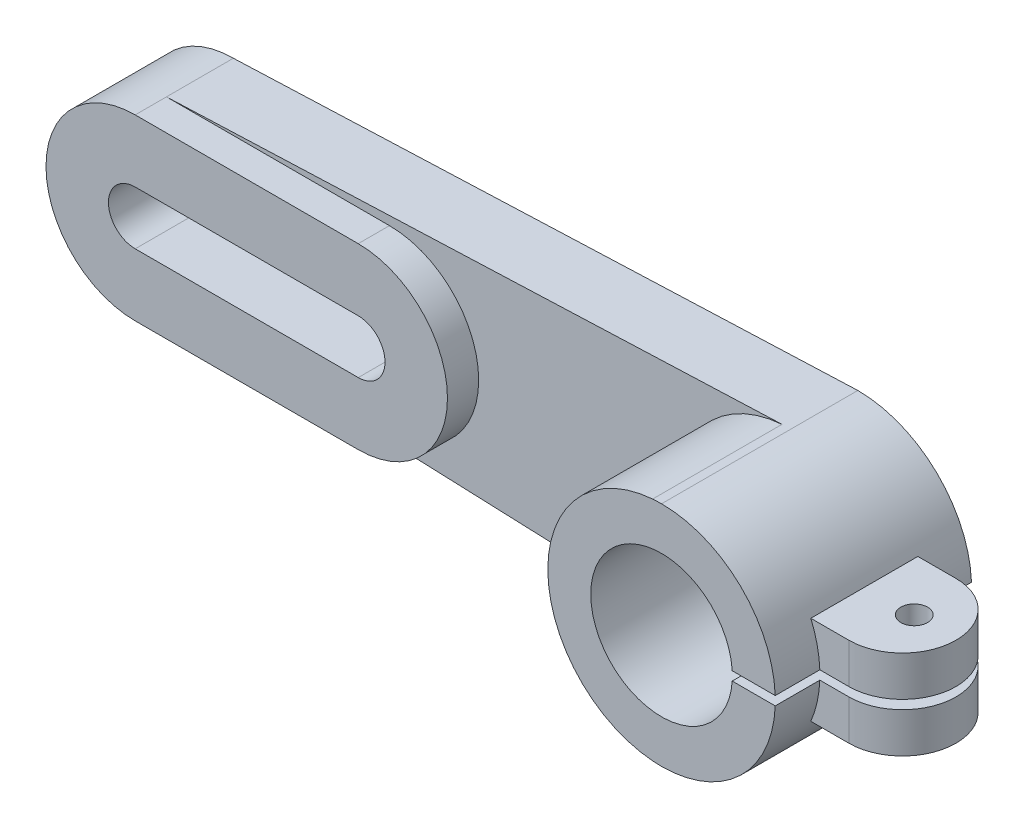
ISO-10303-21;
HEADER;
FILE_DESCRIPTION(('STEP AP214'),'2;1');
FILE_NAME('part.step','',(''),(''),'','','');
FILE_SCHEMA(('AUTOMOTIVE_DESIGN { 1 0 10303 214 1 1 1 1 }'));
ENDSEC;
DATA;
#1=APPLICATION_CONTEXT('core data for automotive mechanical design processes');
#2=APPLICATION_PROTOCOL_DEFINITION('international standard','automotive_design',2000,#1);
#3=PRODUCT_CONTEXT('',#1,'mechanical');
#4=PRODUCT('Part','Part','',(#3));
#5=PRODUCT_RELATED_PRODUCT_CATEGORY('part','',(#4));
#6=PRODUCT_DEFINITION_FORMATION('','',#4);
#7=PRODUCT_DEFINITION_CONTEXT('part definition',#1,'design');
#8=PRODUCT_DEFINITION('design','',#6,#7);
#9=PRODUCT_DEFINITION_SHAPE('','',#8);
#10=(LENGTH_UNIT() NAMED_UNIT(*) SI_UNIT(.MILLI.,.METRE.));
#11=(NAMED_UNIT(*) PLANE_ANGLE_UNIT() SI_UNIT($,.RADIAN.));
#12=(NAMED_UNIT(*) SI_UNIT($,.STERADIAN.) SOLID_ANGLE_UNIT());
#13=UNCERTAINTY_MEASURE_WITH_UNIT(LENGTH_MEASURE(1.E-05),#10,'distance_accuracy_value','');
#14=(GEOMETRIC_REPRESENTATION_CONTEXT(3) GLOBAL_UNCERTAINTY_ASSIGNED_CONTEXT((#13)) GLOBAL_UNIT_ASSIGNED_CONTEXT((#10,
#11,#12)) REPRESENTATION_CONTEXT('',''));
#15=CARTESIAN_POINT('',(0.,0.,0.));
#16=DIRECTION('',(0.,0.,1.));
#17=DIRECTION('',(1.,0.,0.));
#18=AXIS2_PLACEMENT_3D('',#15,#16,#17);
#19=CARTESIAN_POINT('',(32.,-10.,22.));
#20=DIRECTION('',(0.,-1.,0.));
#21=DIRECTION('',(0.,0.,-1.));
#22=AXIS2_PLACEMENT_3D('',#19,#20,#21);
#23=CYLINDRICAL_SURFACE('',#22,12.);
#24=DIRECTION('',(0.,-1.,0.));
#25=VECTOR('',#24,1.);
#26=CARTESIAN_POINT('',(32.,0.,34.));
#27=LINE('',#26,#25);
#28=CARTESIAN_POINT('',(32.,-10.,34.));
#29=VERTEX_POINT('',#28);
#30=CARTESIAN_POINT('',(32.,-1.,34.));
#31=VERTEX_POINT('',#30);
#32=EDGE_CURVE('E465',#29,#31,#27,.F.);
#33=ORIENTED_EDGE('',*,*,#32,.F.);
#34=CARTESIAN_POINT('',(32.,-10.,22.));
#35=DIRECTION('',(0.,-1.,0.));
#36=DIRECTION('',(1.,0.,0.));
#37=AXIS2_PLACEMENT_3D('',#34,#35,#36);
#38=CIRCLE('',#37,12.);
#39=CARTESIAN_POINT('',(32.,-10.,10.));
#40=VERTEX_POINT('',#39);
#41=EDGE_CURVE('E57',#40,#29,#38,.T.);
#42=ORIENTED_EDGE('',*,*,#41,.F.);
#43=DIRECTION('',(0.,1.,0.));
#44=VECTOR('',#43,1.);
#45=CARTESIAN_POINT('',(32.,-10.,10.));
#46=LINE('',#45,#44);
#47=CARTESIAN_POINT('',(32.,-1.,10.));
#48=VERTEX_POINT('',#47);
#49=EDGE_CURVE('E468',#48,#40,#46,.F.);
#50=ORIENTED_EDGE('',*,*,#49,.F.);
#51=CARTESIAN_POINT('',(32.,-1.,22.));
#52=DIRECTION('',(0.,1.,0.));
#53=DIRECTION('',(-1.,0.,0.));
#54=AXIS2_PLACEMENT_3D('',#51,#52,#53);
#55=CIRCLE('',#54,12.);
#56=EDGE_CURVE('E11',#31,#48,#55,.T.);
#57=ORIENTED_EDGE('',*,*,#56,.F.);
#58=EDGE_LOOP('',(#33,#42,#50,#57));
#59=FACE_BOUND('',#58,.T.);
#60=ADVANCED_FACE('F47',(#59),#23,.T.);
#61=CARTESIAN_POINT('',(32.,1.,22.));
#62=DIRECTION('',(0.,1.,0.));
#63=DIRECTION('',(0.,0.,1.));
#64=AXIS2_PLACEMENT_3D('',#61,#62,#63);
#65=CYLINDRICAL_SURFACE('',#64,12.);
#66=DIRECTION('',(0.,-1.,0.));
#67=VECTOR('',#66,1.);
#68=CARTESIAN_POINT('',(32.,1.,34.));
#69=LINE('',#68,#67);
#70=CARTESIAN_POINT('',(32.,1.,34.));
#71=VERTEX_POINT('',#70);
#72=CARTESIAN_POINT('',(32.,10.,34.));
#73=VERTEX_POINT('',#72);
#74=EDGE_CURVE('E451',#71,#73,#69,.F.);
#75=ORIENTED_EDGE('',*,*,#74,.F.);
#76=CARTESIAN_POINT('',(32.,1.,22.));
#77=DIRECTION('',(0.,1.,0.));
#78=DIRECTION('',(-1.,0.,0.));
#79=AXIS2_PLACEMENT_3D('',#76,#77,#78);
#80=CIRCLE('',#79,12.);
#81=CARTESIAN_POINT('',(32.,1.,10.));
#82=VERTEX_POINT('',#81);
#83=EDGE_CURVE('E459',#82,#71,#80,.F.);
#84=ORIENTED_EDGE('',*,*,#83,.F.);
#85=DIRECTION('',(0.,1.,0.));
#86=VECTOR('',#85,1.);
#87=CARTESIAN_POINT('',(32.,0.,10.));
#88=LINE('',#87,#86);
#89=CARTESIAN_POINT('',(32.,10.,10.));
#90=VERTEX_POINT('',#89);
#91=EDGE_CURVE('E455',#90,#82,#88,.F.);
#92=ORIENTED_EDGE('',*,*,#91,.F.);
#93=CARTESIAN_POINT('',(32.,10.,22.));
#94=DIRECTION('',(0.,-1.,0.));
#95=DIRECTION('',(1.,0.,0.));
#96=AXIS2_PLACEMENT_3D('',#93,#94,#95);
#97=CIRCLE('',#96,12.);
#98=EDGE_CURVE('E462',#73,#90,#97,.F.);
#99=ORIENTED_EDGE('',*,*,#98,.F.);
#100=EDGE_LOOP('',(#75,#84,#92,#99));
#101=FACE_BOUND('',#100,.T.);
#102=ADVANCED_FACE('F531',(#101),#65,.T.);
#103=CARTESIAN_POINT('',(0.,1.,44.));
#104=DIRECTION('',(0.,1.,0.));
#105=DIRECTION('',(-1.,0.,0.));
#106=AXIS2_PLACEMENT_3D('',#103,#104,#105);
#107=PLANE('',#106);
#108=CARTESIAN_POINT('',(34.3878652521871,1.,21.7468825609539));
#109=DIRECTION('',(0.,1.,0.));
#110=DIRECTION('',(-1.,0.,0.));
#111=AXIS2_PLACEMENT_3D('',#108,#109,#110);
#112=CIRCLE('',#111,3.);
#113=CARTESIAN_POINT('',(31.3878652521871,1.,21.7468825609539));
#114=VERTEX_POINT('',#113);
#115=EDGE_CURVE('E495',#114,#114,#112,.T.);
#116=ORIENTED_EDGE('',*,*,#115,.T.);
#117=EDGE_LOOP('',(#116));
#118=FACE_BOUND('',#117,.T.);
#119=DIRECTION('',(1.,0.,0.));
#120=VECTOR('',#119,1.);
#121=CARTESIAN_POINT('',(0.,1.,10.));
#122=LINE('',#121,#120);
#123=CARTESIAN_POINT('',(25.4803846124818,1.,10.));
#124=VERTEX_POINT('',#123);
#125=EDGE_CURVE('E244',#124,#82,#122,.T.);
#126=ORIENTED_EDGE('',*,*,#125,.T.);
#127=ORIENTED_EDGE('',*,*,#83,.T.);
#128=DIRECTION('',(1.,0.,0.));
#129=VECTOR('',#128,1.);
#130=CARTESIAN_POINT('',(0.,1.,34.));
#131=LINE('',#130,#129);
#132=CARTESIAN_POINT('',(25.4803846124818,1.,34.));
#133=VERTEX_POINT('',#132);
#134=EDGE_CURVE('E254',#133,#71,#131,.T.);
#135=ORIENTED_EDGE('',*,*,#134,.F.);
#136=DIRECTION('',(0.,0.,-1.));
#137=VECTOR('',#136,1.);
#138=CARTESIAN_POINT('',(25.4803846124818,1.,44.));
#139=LINE('',#138,#137);
#140=CARTESIAN_POINT('',(25.4803846124818,1.,44.));
#141=VERTEX_POINT('',#140);
#142=EDGE_CURVE('E448',#141,#133,#139,.T.);
#143=ORIENTED_EDGE('',*,*,#142,.F.);
#144=DIRECTION('',(1.,0.,0.));
#145=VECTOR('',#144,1.);
#146=CARTESIAN_POINT('',(0.,1.,44.));
#147=LINE('',#146,#145);
#148=CARTESIAN_POINT('',(15.8384626779243,1.,44.));
#149=VERTEX_POINT('',#148);
#150=EDGE_CURVE('E376',#149,#141,#147,.T.);
#151=ORIENTED_EDGE('',*,*,#150,.F.);
#152=DIRECTION('',(0.,0.,-1.));
#153=VECTOR('',#152,1.);
#154=CARTESIAN_POINT('',(15.8384626779243,1.,44.));
#155=LINE('',#154,#153);
#156=CARTESIAN_POINT('',(15.8384626779243,1.,0.));
#157=VERTEX_POINT('',#156);
#158=EDGE_CURVE('E401',#149,#157,#155,.T.);
#159=ORIENTED_EDGE('',*,*,#158,.T.);
#160=DIRECTION('',(1.,0.,0.));
#161=VECTOR('',#160,1.);
#162=CARTESIAN_POINT('',(0.,1.,0.));
#163=LINE('',#162,#161);
#164=CARTESIAN_POINT('',(25.4803846124818,1.,0.));
#165=VERTEX_POINT('',#164);
#166=EDGE_CURVE('E375',#157,#165,#163,.T.);
#167=ORIENTED_EDGE('',*,*,#166,.T.);
#168=EDGE_CURVE('E447',#124,#165,#139,.T.);
#169=ORIENTED_EDGE('',*,*,#168,.F.);
#170=EDGE_LOOP('',(#126,#127,#135,#143,#151,#159,#167,#169));
#171=FACE_BOUND('',#170,.T.);
#172=ADVANCED_FACE('F535',(#118,#171),#107,.F.);
#173=CARTESIAN_POINT('',(0.,0.,44.));
#174=DIRECTION('',(0.,0.,-1.));
#175=DIRECTION('',(-1.,0.,0.));
#176=AXIS2_PLACEMENT_3D('',#173,#174,#175);
#177=CYLINDRICAL_SURFACE('',#176,25.5);
#178=ORIENTED_EDGE('',*,*,#142,.T.);
#179=CARTESIAN_POINT('',(0.,0.,34.));
#180=DIRECTION('',(0.,0.,1.));
#181=DIRECTION('',(1.,0.,0.));
#182=AXIS2_PLACEMENT_3D('',#179,#180,#181);
#183=CIRCLE('',#182,25.5);
#184=CARTESIAN_POINT('',(23.4574082114798,10.,34.));
#185=VERTEX_POINT('',#184);
#186=EDGE_CURVE('E250',#133,#185,#183,.T.);
#187=ORIENTED_EDGE('',*,*,#186,.T.);
#188=DIRECTION('',(0.,0.,-1.));
#189=VECTOR('',#188,1.);
#190=CARTESIAN_POINT('',(23.4574082114798,10.,34.));
#191=LINE('',#190,#189);
#192=CARTESIAN_POINT('',(23.4574082114798,10.,10.));
#193=VERTEX_POINT('',#192);
#194=EDGE_CURVE('E261',#185,#193,#191,.T.);
#195=ORIENTED_EDGE('',*,*,#194,.T.);
#196=CARTESIAN_POINT('',(0.,0.,10.));
#197=DIRECTION('',(0.,0.,1.));
#198=DIRECTION('',(1.,0.,0.));
#199=AXIS2_PLACEMENT_3D('',#196,#197,#198);
#200=CIRCLE('',#199,25.5);
#201=EDGE_CURVE('E239',#124,#193,#200,.T.);
#202=ORIENTED_EDGE('',*,*,#201,.F.);
#203=ORIENTED_EDGE('',*,*,#168,.T.);
#204=CARTESIAN_POINT('',(0.,0.,0.));
#205=DIRECTION('',(0.,0.,1.));
#206=DIRECTION('',(1.,0.,0.));
#207=AXIS2_PLACEMENT_3D('',#204,#205,#206);
#208=CIRCLE('',#207,25.5);
#209=CARTESIAN_POINT('',(0.,25.5,0.));
#210=VERTEX_POINT('',#209);
#211=EDGE_CURVE('E405',#165,#210,#208,.T.);
#212=ORIENTED_EDGE('',*,*,#211,.T.);
#213=DIRECTION('',(0.,0.,-1.));
#214=VECTOR('',#213,1.);
#215=CARTESIAN_POINT('',(0.,25.5,44.));
#216=LINE('',#215,#214);
#217=CARTESIAN_POINT('',(0.,25.5,44.));
#218=VERTEX_POINT('',#217);
#219=EDGE_CURVE('E443',#218,#210,#216,.T.);
#220=ORIENTED_EDGE('',*,*,#219,.F.);
#221=CARTESIAN_POINT('',(0.,0.,44.));
#222=DIRECTION('',(0.,0.,1.));
#223=DIRECTION('',(1.,0.,0.));
#224=AXIS2_PLACEMENT_3D('',#221,#222,#223);
#225=CIRCLE('',#224,25.5);
#226=EDGE_CURVE('E380',#141,#218,#225,.T.);
#227=ORIENTED_EDGE('',*,*,#226,.F.);
#228=EDGE_LOOP('',(#178,#187,#195,#202,#203,#212,#220,#227));
#229=FACE_BOUND('',#228,.T.);
#230=ADVANCED_FACE('F557',(#229),#177,.T.);
#231=CARTESIAN_POINT('',(-1.0002419734848,25.4607047796131,44.));
#232=DIRECTION('',(0.0392554331880378,-0.999229208422782,0.));
#233=DIRECTION('',(0.999229208422782,0.0392554331880378,0.));
#234=AXIS2_PLACEMENT_3D('',#231,#232,#233);
#235=PLANE('',#234);
#236=DIRECTION('',(-0.999229208422782,-0.0392554331880378,0.));
#237=VECTOR('',#236,1.);
#238=CARTESIAN_POINT('',(-1.0002419734848,25.4607047796131,0.));
#239=LINE('',#238,#237);
#240=CARTESIAN_POINT('',(-140.,20.,0.));
#241=VERTEX_POINT('',#240);
#242=EDGE_CURVE('E408',#210,#241,#239,.T.);
#243=ORIENTED_EDGE('',*,*,#242,.T.);
#244=DIRECTION('',(0.,0.,-1.));
#245=VECTOR('',#244,1.);
#246=CARTESIAN_POINT('',(-140.,20.,15.));
#247=LINE('',#246,#245);
#248=CARTESIAN_POINT('',(-140.,20.,15.));
#249=VERTEX_POINT('',#248);
#250=EDGE_CURVE('E368',#249,#241,#247,.T.);
#251=ORIENTED_EDGE('',*,*,#250,.F.);
#252=DIRECTION('',(-0.999229208422782,-0.0392554331880378,0.));
#253=VECTOR('',#252,1.);
#254=CARTESIAN_POINT('',(-1.0002419734848,25.4607047796131,15.));
#255=LINE('',#254,#253);
#256=CARTESIAN_POINT('',(-2.00048394696941,25.4214095592262,15.));
#257=VERTEX_POINT('',#256);
#258=EDGE_CURVE('E360',#257,#249,#255,.T.);
#259=ORIENTED_EDGE('',*,*,#258,.F.);
#260=DIRECTION('',(0.,0.,-1.));
#261=VECTOR('',#260,1.);
#262=CARTESIAN_POINT('',(-2.00048394696941,25.4214095592262,44.));
#263=LINE('',#262,#261);
#264=CARTESIAN_POINT('',(-2.00048394696941,25.4214095592262,44.));
#265=VERTEX_POINT('',#264);
#266=EDGE_CURVE('E440',#265,#257,#263,.T.);
#267=ORIENTED_EDGE('',*,*,#266,.F.);
#268=DIRECTION('',(-0.999229208422782,-0.0392554331880378,0.));
#269=VECTOR('',#268,1.);
#270=CARTESIAN_POINT('',(-1.0002419734848,25.4607047796131,44.));
#271=LINE('',#270,#269);
#272=EDGE_CURVE('E384',#218,#265,#271,.T.);
#273=ORIENTED_EDGE('',*,*,#272,.F.);
#274=ORIENTED_EDGE('',*,*,#219,.T.);
#275=EDGE_LOOP('',(#243,#251,#259,#267,#273,#274));
#276=FACE_BOUND('',#275,.T.);
#277=ADVANCED_FACE('F551',(#276),#235,.F.);
#278=ORIENTED_EDGE('',*,*,#266,.T.);
#279=CARTESIAN_POINT('',(0.,0.,15.));
#280=DIRECTION('',(0.,0.,1.));
#281=DIRECTION('',(1.,0.,0.));
#282=AXIS2_PLACEMENT_3D('',#279,#280,#281);
#283=CIRCLE('',#282,25.5);
#284=CARTESIAN_POINT('',(-2.00048394696941,-25.4214095592262,15.));
#285=VERTEX_POINT('',#284);
#286=EDGE_CURVE('E357',#257,#285,#283,.T.);
#287=ORIENTED_EDGE('',*,*,#286,.T.);
#288=DIRECTION('',(0.,0.,-1.));
#289=VECTOR('',#288,1.);
#290=CARTESIAN_POINT('',(-2.00048394696941,-25.4214095592262,44.));
#291=LINE('',#290,#289);
#292=CARTESIAN_POINT('',(-2.00048394696941,-25.4214095592262,44.));
#293=VERTEX_POINT('',#292);
#294=EDGE_CURVE('E436',#293,#285,#291,.T.);
#295=ORIENTED_EDGE('',*,*,#294,.F.);
#296=EDGE_CURVE('E386',#265,#293,#225,.T.);
#297=ORIENTED_EDGE('',*,*,#296,.F.);
#298=EDGE_LOOP('',(#278,#287,#295,#297));
#299=FACE_BOUND('',#298,.T.);
#300=ADVANCED_FACE('F633',(#299),#177,.T.);
#301=CARTESIAN_POINT('',(-1.0002419734848,-25.4607047796131,44.));
#302=DIRECTION('',(-0.0392554331880378,-0.999229208422782,0.));
#303=DIRECTION('',(0.999229208422782,-0.0392554331880378,0.));
#304=AXIS2_PLACEMENT_3D('',#301,#302,#303);
#305=PLANE('',#304);
#306=DIRECTION('',(-0.999229208422782,0.0392554331880378,0.));
#307=VECTOR('',#306,1.);
#308=CARTESIAN_POINT('',(-1.0002419734848,-25.4607047796131,0.));
#309=LINE('',#308,#307);
#310=CARTESIAN_POINT('',(0.,-25.5,0.));
#311=VERTEX_POINT('',#310);
#312=CARTESIAN_POINT('',(-140.,-20.,0.));
#313=VERTEX_POINT('',#312);
#314=EDGE_CURVE('E413',#311,#313,#309,.T.);
#315=ORIENTED_EDGE('',*,*,#314,.F.);
#316=DIRECTION('',(0.,0.,-1.));
#317=VECTOR('',#316,1.);
#318=CARTESIAN_POINT('',(0.,-25.5,44.));
#319=LINE('',#318,#317);
#320=CARTESIAN_POINT('',(0.,-25.5,44.));
#321=VERTEX_POINT('',#320);
#322=EDGE_CURVE('E433',#321,#311,#319,.T.);
#323=ORIENTED_EDGE('',*,*,#322,.F.);
#324=DIRECTION('',(-0.999229208422782,0.0392554331880378,0.));
#325=VECTOR('',#324,1.);
#326=CARTESIAN_POINT('',(-1.0002419734848,-25.4607047796131,44.));
#327=LINE('',#326,#325);
#328=EDGE_CURVE('E389',#321,#293,#327,.T.);
#329=ORIENTED_EDGE('',*,*,#328,.T.);
#330=ORIENTED_EDGE('',*,*,#294,.T.);
#331=DIRECTION('',(-0.999229208422782,0.0392554331880378,0.));
#332=VECTOR('',#331,1.);
#333=CARTESIAN_POINT('',(-1.0002419734848,-25.4607047796131,15.));
#334=LINE('',#333,#332);
#335=CARTESIAN_POINT('',(-140.,-20.,15.));
#336=VERTEX_POINT('',#335);
#337=EDGE_CURVE('E353',#285,#336,#334,.T.);
#338=ORIENTED_EDGE('',*,*,#337,.T.);
#339=DIRECTION('',(0.,0.,-1.));
#340=VECTOR('',#339,1.);
#341=CARTESIAN_POINT('',(-140.,-20.,15.));
#342=LINE('',#341,#340);
#343=EDGE_CURVE('E371',#336,#313,#342,.T.);
#344=ORIENTED_EDGE('',*,*,#343,.T.);
#345=EDGE_LOOP('',(#315,#323,#329,#330,#338,#344));
#346=FACE_BOUND('',#345,.T.);
#347=ADVANCED_FACE('F543',(#346),#305,.T.);
#348=DIRECTION('',(0.,0.,-1.));
#349=VECTOR('',#348,1.);
#350=CARTESIAN_POINT('',(23.4574082114798,-10.,34.));
#351=LINE('',#350,#349);
#352=CARTESIAN_POINT('',(23.4574082114798,-10.,34.));
#353=VERTEX_POINT('',#352);
#354=CARTESIAN_POINT('',(23.4574082114798,-10.,10.));
#355=VERTEX_POINT('',#354);
#356=EDGE_CURVE('E218',#353,#355,#351,.T.);
#357=ORIENTED_EDGE('',*,*,#356,.F.);
#358=CARTESIAN_POINT('',(0.,0.,34.));
#359=DIRECTION('',(0.,0.,1.));
#360=DIRECTION('',(1.,0.,0.));
#361=AXIS2_PLACEMENT_3D('',#358,#359,#360);
#362=CIRCLE('',#361,25.5);
#363=CARTESIAN_POINT('',(25.4803846124818,-1.,34.));
#364=VERTEX_POINT('',#363);
#365=EDGE_CURVE('E224',#353,#364,#362,.T.);
#366=ORIENTED_EDGE('',*,*,#365,.T.);
#367=DIRECTION('',(0.,0.,-1.));
#368=VECTOR('',#367,1.);
#369=CARTESIAN_POINT('',(25.4803846124818,-1.,44.));
#370=LINE('',#369,#368);
#371=CARTESIAN_POINT('',(25.4803846124818,-1.,44.));
#372=VERTEX_POINT('',#371);
#373=EDGE_CURVE('E430',#372,#364,#370,.T.);
#374=ORIENTED_EDGE('',*,*,#373,.F.);
#375=EDGE_CURVE('E385',#321,#372,#225,.T.);
#376=ORIENTED_EDGE('',*,*,#375,.F.);
#377=ORIENTED_EDGE('',*,*,#322,.T.);
#378=CARTESIAN_POINT('',(25.4803846124818,-1.,0.));
#379=VERTEX_POINT('',#378);
#380=EDGE_CURVE('E409',#311,#379,#208,.T.);
#381=ORIENTED_EDGE('',*,*,#380,.T.);
#382=CARTESIAN_POINT('',(25.4803846124818,-1.,10.));
#383=VERTEX_POINT('',#382);
#384=EDGE_CURVE('E429',#383,#379,#370,.T.);
#385=ORIENTED_EDGE('',*,*,#384,.F.);
#386=CARTESIAN_POINT('',(0.,0.,10.));
#387=DIRECTION('',(0.,0.,1.));
#388=DIRECTION('',(1.,0.,0.));
#389=AXIS2_PLACEMENT_3D('',#386,#387,#388);
#390=CIRCLE('',#389,25.5);
#391=EDGE_CURVE('E237',#355,#383,#390,.T.);
#392=ORIENTED_EDGE('',*,*,#391,.F.);
#393=EDGE_LOOP('',(#357,#366,#374,#376,#377,#381,#385,#392));
#394=FACE_BOUND('',#393,.T.);
#395=ADVANCED_FACE('F234',(#394),#177,.T.);
#396=CARTESIAN_POINT('',(0.,-1.,44.));
#397=DIRECTION('',(0.,1.,0.));
#398=DIRECTION('',(-1.,0.,0.));
#399=AXIS2_PLACEMENT_3D('',#396,#397,#398);
#400=PLANE('',#399);
#401=CARTESIAN_POINT('',(34.3878652521871,-1.,21.7468825609539));
#402=DIRECTION('',(0.,1.,0.));
#403=DIRECTION('',(-1.,0.,0.));
#404=AXIS2_PLACEMENT_3D('',#401,#402,#403);
#405=CIRCLE('',#404,3.);
#406=CARTESIAN_POINT('',(31.3878652521871,-1.,21.7468825609539));
#407=VERTEX_POINT('',#406);
#408=EDGE_CURVE('E500',#407,#407,#405,.T.);
#409=ORIENTED_EDGE('',*,*,#408,.F.);
#410=EDGE_LOOP('',(#409));
#411=FACE_BOUND('',#410,.T.);
#412=DIRECTION('',(1.,0.,0.));
#413=VECTOR('',#412,1.);
#414=CARTESIAN_POINT('',(0.,-1.,34.));
#415=LINE('',#414,#413);
#416=EDGE_CURVE('E223',#364,#31,#415,.T.);
#417=ORIENTED_EDGE('',*,*,#416,.T.);
#418=ORIENTED_EDGE('',*,*,#56,.T.);
#419=DIRECTION('',(1.,0.,0.));
#420=VECTOR('',#419,1.);
#421=CARTESIAN_POINT('',(0.,-1.,10.));
#422=LINE('',#421,#420);
#423=EDGE_CURVE('E232',#383,#48,#422,.T.);
#424=ORIENTED_EDGE('',*,*,#423,.F.);
#425=ORIENTED_EDGE('',*,*,#384,.T.);
#426=DIRECTION('',(1.,0.,0.));
#427=VECTOR('',#426,1.);
#428=CARTESIAN_POINT('',(0.,-1.,0.));
#429=LINE('',#428,#427);
#430=CARTESIAN_POINT('',(15.8384626779243,-1.,0.));
#431=VERTEX_POINT('',#430);
#432=EDGE_CURVE('E417',#431,#379,#429,.T.);
#433=ORIENTED_EDGE('',*,*,#432,.F.);
#434=DIRECTION('',(0.,0.,-1.));
#435=VECTOR('',#434,1.);
#436=CARTESIAN_POINT('',(15.8384626779243,-1.,44.));
#437=LINE('',#436,#435);
#438=CARTESIAN_POINT('',(15.8384626779243,-1.,44.));
#439=VERTEX_POINT('',#438);
#440=EDGE_CURVE('E426',#439,#431,#437,.T.);
#441=ORIENTED_EDGE('',*,*,#440,.F.);
#442=DIRECTION('',(1.,0.,0.));
#443=VECTOR('',#442,1.);
#444=CARTESIAN_POINT('',(0.,-1.,44.));
#445=LINE('',#444,#443);
#446=EDGE_CURVE('E393',#439,#372,#445,.T.);
#447=ORIENTED_EDGE('',*,*,#446,.T.);
#448=ORIENTED_EDGE('',*,*,#373,.T.);
#449=EDGE_LOOP('',(#417,#418,#424,#425,#433,#441,#447,#448));
#450=FACE_BOUND('',#449,.T.);
#451=ADVANCED_FACE('F487',(#411,#450),#400,.T.);
#452=CARTESIAN_POINT('',(0.,0.,44.));
#453=DIRECTION('',(0.,0.,-1.));
#454=DIRECTION('',(-1.,0.,0.));
#455=AXIS2_PLACEMENT_3D('',#452,#453,#454);
#456=CYLINDRICAL_SURFACE('',#455,15.87);
#457=CARTESIAN_POINT('',(0.,0.,0.));
#458=DIRECTION('',(0.,0.,1.));
#459=DIRECTION('',(1.,0.,0.));
#460=AXIS2_PLACEMENT_3D('',#457,#458,#459);
#461=CIRCLE('',#460,15.87);
#462=EDGE_CURVE('E381',#157,#431,#461,.T.);
#463=ORIENTED_EDGE('',*,*,#462,.F.);
#464=ORIENTED_EDGE('',*,*,#158,.F.);
#465=CARTESIAN_POINT('',(0.,0.,44.));
#466=DIRECTION('',(0.,0.,1.));
#467=DIRECTION('',(1.,0.,0.));
#468=AXIS2_PLACEMENT_3D('',#465,#466,#467);
#469=CIRCLE('',#468,15.87);
#470=EDGE_CURVE('E397',#149,#439,#469,.T.);
#471=ORIENTED_EDGE('',*,*,#470,.T.);
#472=ORIENTED_EDGE('',*,*,#440,.T.);
#473=EDGE_LOOP('',(#463,#464,#471,#472));
#474=FACE_BOUND('',#473,.T.);
#475=ADVANCED_FACE('F565',(#474),#456,.F.);
#476=CARTESIAN_POINT('',(0.,0.,44.));
#477=DIRECTION('',(0.,0.,1.));
#478=DIRECTION('',(1.,0.,0.));
#479=AXIS2_PLACEMENT_3D('',#476,#477,#478);
#480=PLANE('',#479);
#481=ORIENTED_EDGE('',*,*,#150,.T.);
#482=ORIENTED_EDGE('',*,*,#226,.T.);
#483=ORIENTED_EDGE('',*,*,#272,.T.);
#484=ORIENTED_EDGE('',*,*,#296,.T.);
#485=ORIENTED_EDGE('',*,*,#328,.F.);
#486=ORIENTED_EDGE('',*,*,#375,.T.);
#487=ORIENTED_EDGE('',*,*,#446,.F.);
#488=ORIENTED_EDGE('',*,*,#470,.F.);
#489=EDGE_LOOP('',(#481,#482,#483,#484,#485,#486,#487,#488));
#490=FACE_BOUND('',#489,.T.);
#491=ADVANCED_FACE('F539',(#490),#480,.T.);
#492=CARTESIAN_POINT('',(0.,0.,0.));
#493=DIRECTION('',(0.,0.,1.));
#494=DIRECTION('',(1.,0.,0.));
#495=AXIS2_PLACEMENT_3D('',#492,#493,#494);
#496=PLANE('',#495);
#497=ORIENTED_EDGE('',*,*,#166,.F.);
#498=ORIENTED_EDGE('',*,*,#462,.T.);
#499=ORIENTED_EDGE('',*,*,#432,.T.);
#500=ORIENTED_EDGE('',*,*,#380,.F.);
#501=ORIENTED_EDGE('',*,*,#314,.T.);
#502=CARTESIAN_POINT('',(-140.,0.,0.));
#503=DIRECTION('',(0.,0.,1.));
#504=DIRECTION('',(1.,0.,0.));
#505=AXIS2_PLACEMENT_3D('',#502,#503,#504);
#506=CIRCLE('',#505,20.);
#507=EDGE_CURVE('E277',#241,#313,#506,.T.);
#508=ORIENTED_EDGE('',*,*,#507,.F.);
#509=ORIENTED_EDGE('',*,*,#242,.F.);
#510=ORIENTED_EDGE('',*,*,#211,.F.);
#511=EDGE_LOOP('',(#497,#498,#499,#500,#501,#508,#509,#510));
#512=FACE_BOUND('',#511,.T.);
#513=CARTESIAN_POINT('',(-90.,0.,0.));
#514=DIRECTION('',(0.,0.,1.));
#515=DIRECTION('',(1.,0.,0.));
#516=AXIS2_PLACEMENT_3D('',#513,#514,#515);
#517=CIRCLE('',#516,6.);
#518=CARTESIAN_POINT('',(-90.,-6.,0.));
#519=VERTEX_POINT('',#518);
#520=CARTESIAN_POINT('',(-90.,6.,0.));
#521=VERTEX_POINT('',#520);
#522=EDGE_CURVE('E271',#519,#521,#517,.T.);
#523=ORIENTED_EDGE('',*,*,#522,.T.);
#524=DIRECTION('',(1.,0.,0.));
#525=VECTOR('',#524,1.);
#526=CARTESIAN_POINT('',(0.,6.,0.));
#527=LINE('',#526,#525);
#528=CARTESIAN_POINT('',(-140.,6.,0.));
#529=VERTEX_POINT('',#528);
#530=EDGE_CURVE('E314',#529,#521,#527,.T.);
#531=ORIENTED_EDGE('',*,*,#530,.F.);
#532=CARTESIAN_POINT('',(-140.,0.,0.));
#533=DIRECTION('',(0.,0.,1.));
#534=DIRECTION('',(1.,0.,0.));
#535=AXIS2_PLACEMENT_3D('',#532,#533,#534);
#536=CIRCLE('',#535,6.);
#537=CARTESIAN_POINT('',(-140.,-6.,0.));
#538=VERTEX_POINT('',#537);
#539=EDGE_CURVE('E310',#529,#538,#536,.T.);
#540=ORIENTED_EDGE('',*,*,#539,.T.);
#541=DIRECTION('',(1.,0.,0.));
#542=VECTOR('',#541,1.);
#543=CARTESIAN_POINT('',(0.,-6.,0.));
#544=LINE('',#543,#542);
#545=EDGE_CURVE('E306',#538,#519,#544,.T.);
#546=ORIENTED_EDGE('',*,*,#545,.T.);
#547=EDGE_LOOP('',(#523,#531,#540,#546));
#548=FACE_BOUND('',#547,.T.);
#549=ADVANCED_FACE('F484',(#512,#548),#496,.F.);
#550=CARTESIAN_POINT('',(0.,0.,15.));
#551=DIRECTION('',(0.,0.,1.));
#552=DIRECTION('',(1.,0.,0.));
#553=AXIS2_PLACEMENT_3D('',#550,#551,#552);
#554=PLANE('',#553);
#555=CARTESIAN_POINT('',(-90.,0.,15.));
#556=DIRECTION('',(0.,0.,1.));
#557=DIRECTION('',(1.,0.,0.));
#558=AXIS2_PLACEMENT_3D('',#555,#556,#557);
#559=CIRCLE('',#558,20.);
#560=CARTESIAN_POINT('',(-90.,-20.,15.));
#561=VERTEX_POINT('',#560);
#562=CARTESIAN_POINT('',(-90.,20.,15.));
#563=VERTEX_POINT('',#562);
#564=EDGE_CURVE('E336',#561,#563,#559,.T.);
#565=ORIENTED_EDGE('',*,*,#564,.F.);
#566=DIRECTION('',(1.,0.,0.));
#567=VECTOR('',#566,1.);
#568=CARTESIAN_POINT('',(0.,-20.,15.));
#569=LINE('',#568,#567);
#570=EDGE_CURVE('E350',#336,#561,#569,.T.);
#571=ORIENTED_EDGE('',*,*,#570,.F.);
#572=ORIENTED_EDGE('',*,*,#337,.F.);
#573=ORIENTED_EDGE('',*,*,#286,.F.);
#574=ORIENTED_EDGE('',*,*,#258,.T.);
#575=DIRECTION('',(1.,0.,0.));
#576=VECTOR('',#575,1.);
#577=CARTESIAN_POINT('',(0.,20.,15.));
#578=LINE('',#577,#576);
#579=EDGE_CURVE('E364',#249,#563,#578,.T.);
#580=ORIENTED_EDGE('',*,*,#579,.T.);
#581=EDGE_LOOP('',(#565,#571,#572,#573,#574,#580));
#582=FACE_BOUND('',#581,.T.);
#583=ADVANCED_FACE('F603',(#582),#554,.T.);
#584=CARTESIAN_POINT('',(0.,-20.,22.));
#585=DIRECTION('',(0.,1.,0.));
#586=DIRECTION('',(0.,0.,1.));
#587=AXIS2_PLACEMENT_3D('',#584,#585,#586);
#588=PLANE('',#587);
#589=ORIENTED_EDGE('',*,*,#570,.T.);
#590=DIRECTION('',(0.,0.,-1.));
#591=VECTOR('',#590,1.);
#592=CARTESIAN_POINT('',(-90.,-20.,22.));
#593=LINE('',#592,#591);
#594=CARTESIAN_POINT('',(-90.,-20.,22.));
#595=VERTEX_POINT('',#594);
#596=EDGE_CURVE('E332',#595,#561,#593,.T.);
#597=ORIENTED_EDGE('',*,*,#596,.F.);
#598=DIRECTION('',(1.,0.,0.));
#599=VECTOR('',#598,1.);
#600=CARTESIAN_POINT('',(0.,-20.,22.));
#601=LINE('',#600,#599);
#602=CARTESIAN_POINT('',(-140.,-20.,22.));
#603=VERTEX_POINT('',#602);
#604=EDGE_CURVE('E288',#603,#595,#601,.T.);
#605=ORIENTED_EDGE('',*,*,#604,.F.);
#606=DIRECTION('',(0.,0.,-1.));
#607=VECTOR('',#606,1.);
#608=CARTESIAN_POINT('',(-140.,-20.,22.));
#609=LINE('',#608,#607);
#610=EDGE_CURVE('E320',#603,#336,#609,.T.);
#611=ORIENTED_EDGE('',*,*,#610,.T.);
#612=EDGE_LOOP('',(#589,#597,#605,#611));
#613=FACE_BOUND('',#612,.T.);
#614=ADVANCED_FACE('F599',(#613),#588,.F.);
#615=CARTESIAN_POINT('',(-90.,0.,22.));
#616=DIRECTION('',(0.,0.,-1.));
#617=DIRECTION('',(-1.,0.,0.));
#618=AXIS2_PLACEMENT_3D('',#615,#616,#617);
#619=CYLINDRICAL_SURFACE('',#618,20.);
#620=ORIENTED_EDGE('',*,*,#564,.T.);
#621=DIRECTION('',(0.,0.,-1.));
#622=VECTOR('',#621,1.);
#623=CARTESIAN_POINT('',(-90.,20.,22.));
#624=LINE('',#623,#622);
#625=CARTESIAN_POINT('',(-90.,20.,22.));
#626=VERTEX_POINT('',#625);
#627=EDGE_CURVE('E329',#626,#563,#624,.T.);
#628=ORIENTED_EDGE('',*,*,#627,.F.);
#629=CARTESIAN_POINT('',(-90.,0.,22.));
#630=DIRECTION('',(0.,0.,1.));
#631=DIRECTION('',(1.,0.,0.));
#632=AXIS2_PLACEMENT_3D('',#629,#630,#631);
#633=CIRCLE('',#632,20.);
#634=EDGE_CURVE('E292',#595,#626,#633,.T.);
#635=ORIENTED_EDGE('',*,*,#634,.F.);
#636=ORIENTED_EDGE('',*,*,#596,.T.);
#637=EDGE_LOOP('',(#620,#628,#635,#636));
#638=FACE_BOUND('',#637,.T.);
#639=ADVANCED_FACE('F595',(#638),#619,.T.);
#640=CARTESIAN_POINT('',(0.,20.,22.));
#641=DIRECTION('',(0.,1.,0.));
#642=DIRECTION('',(0.,0.,1.));
#643=AXIS2_PLACEMENT_3D('',#640,#641,#642);
#644=PLANE('',#643);
#645=ORIENTED_EDGE('',*,*,#627,.T.);
#646=ORIENTED_EDGE('',*,*,#579,.F.);
#647=DIRECTION('',(0.,0.,-1.));
#648=VECTOR('',#647,1.);
#649=CARTESIAN_POINT('',(-140.,20.,22.));
#650=LINE('',#649,#648);
#651=CARTESIAN_POINT('',(-140.,20.,22.));
#652=VERTEX_POINT('',#651);
#653=EDGE_CURVE('E324',#652,#249,#650,.T.);
#654=ORIENTED_EDGE('',*,*,#653,.F.);
#655=DIRECTION('',(1.,0.,0.));
#656=VECTOR('',#655,1.);
#657=CARTESIAN_POINT('',(0.,20.,22.));
#658=LINE('',#657,#656);
#659=EDGE_CURVE('E295',#652,#626,#658,.T.);
#660=ORIENTED_EDGE('',*,*,#659,.T.);
#661=EDGE_LOOP('',(#645,#646,#654,#660));
#662=FACE_BOUND('',#661,.T.);
#663=ADVANCED_FACE('F591',(#662),#644,.T.);
#664=CARTESIAN_POINT('',(-90.,0.,22.));
#665=DIRECTION('',(0.,0.,-1.));
#666=DIRECTION('',(-1.,0.,0.));
#667=AXIS2_PLACEMENT_3D('',#664,#665,#666);
#668=CYLINDRICAL_SURFACE('',#667,6.);
#669=ORIENTED_EDGE('',*,*,#522,.F.);
#670=DIRECTION('',(0.,0.,-1.));
#671=VECTOR('',#670,1.);
#672=CARTESIAN_POINT('',(-90.,-6.,22.));
#673=LINE('',#672,#671);
#674=CARTESIAN_POINT('',(-90.,-6.,22.));
#675=VERTEX_POINT('',#674);
#676=EDGE_CURVE('E325',#675,#519,#673,.T.);
#677=ORIENTED_EDGE('',*,*,#676,.F.);
#678=CARTESIAN_POINT('',(-90.,0.,22.));
#679=DIRECTION('',(0.,0.,1.));
#680=DIRECTION('',(1.,0.,0.));
#681=AXIS2_PLACEMENT_3D('',#678,#679,#680);
#682=CIRCLE('',#681,6.);
#683=CARTESIAN_POINT('',(-90.,6.,22.));
#684=VERTEX_POINT('',#683);
#685=EDGE_CURVE('E272',#675,#684,#682,.T.);
#686=ORIENTED_EDGE('',*,*,#685,.T.);
#687=DIRECTION('',(0.,0.,-1.));
#688=VECTOR('',#687,1.);
#689=CARTESIAN_POINT('',(-90.,6.,22.));
#690=LINE('',#689,#688);
#691=EDGE_CURVE('E302',#684,#521,#690,.T.);
#692=ORIENTED_EDGE('',*,*,#691,.T.);
#693=EDGE_LOOP('',(#669,#677,#686,#692));
#694=FACE_BOUND('',#693,.T.);
#695=ADVANCED_FACE('F594',(#694),#668,.F.);
#696=CARTESIAN_POINT('',(0.,-6.,22.));
#697=DIRECTION('',(0.,1.,0.));
#698=DIRECTION('',(0.,0.,1.));
#699=AXIS2_PLACEMENT_3D('',#696,#697,#698);
#700=PLANE('',#699);
#701=ORIENTED_EDGE('',*,*,#545,.F.);
#702=DIRECTION('',(0.,0.,-1.));
#703=VECTOR('',#702,1.);
#704=CARTESIAN_POINT('',(-140.,-6.,22.));
#705=LINE('',#704,#703);
#706=CARTESIAN_POINT('',(-140.,-6.,22.));
#707=VERTEX_POINT('',#706);
#708=EDGE_CURVE('E342',#707,#538,#705,.T.);
#709=ORIENTED_EDGE('',*,*,#708,.F.);
#710=DIRECTION('',(1.,0.,0.));
#711=VECTOR('',#710,1.);
#712=CARTESIAN_POINT('',(0.,-6.,22.));
#713=LINE('',#712,#711);
#714=EDGE_CURVE('E276',#707,#675,#713,.T.);
#715=ORIENTED_EDGE('',*,*,#714,.T.);
#716=ORIENTED_EDGE('',*,*,#676,.T.);
#717=EDGE_LOOP('',(#701,#709,#715,#716));
#718=FACE_BOUND('',#717,.T.);
#719=ADVANCED_FACE('F611',(#718),#700,.T.);
#720=CARTESIAN_POINT('',(-140.,0.,22.));
#721=DIRECTION('',(0.,0.,-1.));
#722=DIRECTION('',(-1.,0.,0.));
#723=AXIS2_PLACEMENT_3D('',#720,#721,#722);
#724=CYLINDRICAL_SURFACE('',#723,6.);
#725=ORIENTED_EDGE('',*,*,#539,.F.);
#726=DIRECTION('',(0.,0.,-1.));
#727=VECTOR('',#726,1.);
#728=CARTESIAN_POINT('',(-140.,6.,22.));
#729=LINE('',#728,#727);
#730=CARTESIAN_POINT('',(-140.,6.,22.));
#731=VERTEX_POINT('',#730);
#732=EDGE_CURVE('E339',#731,#529,#729,.T.);
#733=ORIENTED_EDGE('',*,*,#732,.F.);
#734=CARTESIAN_POINT('',(-140.,0.,22.));
#735=DIRECTION('',(0.,0.,1.));
#736=DIRECTION('',(1.,0.,0.));
#737=AXIS2_PLACEMENT_3D('',#734,#735,#736);
#738=CIRCLE('',#737,6.);
#739=EDGE_CURVE('E281',#731,#707,#738,.T.);
#740=ORIENTED_EDGE('',*,*,#739,.T.);
#741=ORIENTED_EDGE('',*,*,#708,.T.);
#742=EDGE_LOOP('',(#725,#733,#740,#741));
#743=FACE_BOUND('',#742,.T.);
#744=ADVANCED_FACE('F607',(#743),#724,.F.);
#745=CARTESIAN_POINT('',(0.,6.,22.));
#746=DIRECTION('',(0.,1.,0.));
#747=DIRECTION('',(0.,0.,1.));
#748=AXIS2_PLACEMENT_3D('',#745,#746,#747);
#749=PLANE('',#748);
#750=ORIENTED_EDGE('',*,*,#530,.T.);
#751=ORIENTED_EDGE('',*,*,#691,.F.);
#752=DIRECTION('',(1.,0.,0.));
#753=VECTOR('',#752,1.);
#754=CARTESIAN_POINT('',(0.,6.,22.));
#755=LINE('',#754,#753);
#756=EDGE_CURVE('E285',#731,#684,#755,.T.);
#757=ORIENTED_EDGE('',*,*,#756,.F.);
#758=ORIENTED_EDGE('',*,*,#732,.T.);
#759=EDGE_LOOP('',(#750,#751,#757,#758));
#760=FACE_BOUND('',#759,.T.);
#761=ADVANCED_FACE('F590',(#760),#749,.F.);
#762=CARTESIAN_POINT('',(-140.,0.,22.));
#763=DIRECTION('',(0.,0.,-1.));
#764=DIRECTION('',(-1.,0.,0.));
#765=AXIS2_PLACEMENT_3D('',#762,#763,#764);
#766=CYLINDRICAL_SURFACE('',#765,20.);
#767=ORIENTED_EDGE('',*,*,#507,.T.);
#768=ORIENTED_EDGE('',*,*,#343,.F.);
#769=ORIENTED_EDGE('',*,*,#610,.F.);
#770=CARTESIAN_POINT('',(-140.,0.,22.));
#771=DIRECTION('',(0.,0.,1.));
#772=DIRECTION('',(1.,0.,0.));
#773=AXIS2_PLACEMENT_3D('',#770,#771,#772);
#774=CIRCLE('',#773,20.);
#775=EDGE_CURVE('E299',#652,#603,#774,.T.);
#776=ORIENTED_EDGE('',*,*,#775,.F.);
#777=ORIENTED_EDGE('',*,*,#653,.T.);
#778=ORIENTED_EDGE('',*,*,#250,.T.);
#779=EDGE_LOOP('',(#767,#768,#769,#776,#777,#778));
#780=FACE_BOUND('',#779,.T.);
#781=ADVANCED_FACE('F586',(#780),#766,.T.);
#782=CARTESIAN_POINT('',(0.,0.,22.));
#783=DIRECTION('',(0.,0.,1.));
#784=DIRECTION('',(1.,0.,0.));
#785=AXIS2_PLACEMENT_3D('',#782,#783,#784);
#786=PLANE('',#785);
#787=ORIENTED_EDGE('',*,*,#685,.F.);
#788=ORIENTED_EDGE('',*,*,#714,.F.);
#789=ORIENTED_EDGE('',*,*,#739,.F.);
#790=ORIENTED_EDGE('',*,*,#756,.T.);
#791=EDGE_LOOP('',(#787,#788,#789,#790));
#792=FACE_BOUND('',#791,.T.);
#793=ORIENTED_EDGE('',*,*,#604,.T.);
#794=ORIENTED_EDGE('',*,*,#634,.T.);
#795=ORIENTED_EDGE('',*,*,#659,.F.);
#796=ORIENTED_EDGE('',*,*,#775,.T.);
#797=EDGE_LOOP('',(#793,#794,#795,#796));
#798=FACE_BOUND('',#797,.T.);
#799=ADVANCED_FACE('F580',(#792,#798),#786,.T.);
#800=CARTESIAN_POINT('',(0.,10.,34.));
#801=DIRECTION('',(0.,-1.,0.));
#802=DIRECTION('',(1.,0.,0.));
#803=AXIS2_PLACEMENT_3D('',#800,#801,#802);
#804=PLANE('',#803);
#805=CARTESIAN_POINT('',(34.3878652521871,10.,21.7468825609539));
#806=DIRECTION('',(0.,1.,0.));
#807=DIRECTION('',(0.,0.,1.));
#808=AXIS2_PLACEMENT_3D('',#805,#806,#807);
#809=CIRCLE('',#808,3.);
#810=CARTESIAN_POINT('',(34.3878652521871,10.,24.7468825609539));
#811=VERTEX_POINT('',#810);
#812=EDGE_CURVE('E506',#811,#811,#809,.T.);
#813=ORIENTED_EDGE('',*,*,#812,.F.);
#814=EDGE_LOOP('',(#813));
#815=FACE_BOUND('',#814,.T.);
#816=DIRECTION('',(-1.,0.,0.));
#817=VECTOR('',#816,1.);
#818=CARTESIAN_POINT('',(0.,10.,34.));
#819=LINE('',#818,#817);
#820=EDGE_CURVE('E259',#73,#185,#819,.T.);
#821=ORIENTED_EDGE('',*,*,#820,.F.);
#822=ORIENTED_EDGE('',*,*,#98,.T.);
#823=DIRECTION('',(-1.,0.,0.));
#824=VECTOR('',#823,1.);
#825=CARTESIAN_POINT('',(0.,10.,10.));
#826=LINE('',#825,#824);
#827=EDGE_CURVE('E255',#90,#193,#826,.T.);
#828=ORIENTED_EDGE('',*,*,#827,.T.);
#829=ORIENTED_EDGE('',*,*,#194,.F.);
#830=EDGE_LOOP('',(#821,#822,#828,#829));
#831=FACE_BOUND('',#830,.T.);
#832=ADVANCED_FACE('F572',(#815,#831),#804,.F.);
#833=CARTESIAN_POINT('',(0.,0.,34.));
#834=DIRECTION('',(0.,0.,1.));
#835=DIRECTION('',(1.,0.,0.));
#836=AXIS2_PLACEMENT_3D('',#833,#834,#835);
#837=PLANE('',#836);
#838=ORIENTED_EDGE('',*,*,#134,.T.);
#839=ORIENTED_EDGE('',*,*,#74,.T.);
#840=ORIENTED_EDGE('',*,*,#820,.T.);
#841=ORIENTED_EDGE('',*,*,#186,.F.);
#842=EDGE_LOOP('',(#838,#839,#840,#841));
#843=FACE_BOUND('',#842,.T.);
#844=ADVANCED_FACE('F525',(#843),#837,.T.);
#845=CARTESIAN_POINT('',(0.,0.,10.));
#846=DIRECTION('',(0.,0.,1.));
#847=DIRECTION('',(1.,0.,0.));
#848=AXIS2_PLACEMENT_3D('',#845,#846,#847);
#849=PLANE('',#848);
#850=ORIENTED_EDGE('',*,*,#827,.F.);
#851=ORIENTED_EDGE('',*,*,#91,.T.);
#852=ORIENTED_EDGE('',*,*,#125,.F.);
#853=ORIENTED_EDGE('',*,*,#201,.T.);
#854=EDGE_LOOP('',(#850,#851,#852,#853));
#855=FACE_BOUND('',#854,.T.);
#856=ADVANCED_FACE('F518',(#855),#849,.F.);
#857=CARTESIAN_POINT('',(0.,-10.,34.));
#858=DIRECTION('',(0.,-1.,0.));
#859=DIRECTION('',(1.,0.,0.));
#860=AXIS2_PLACEMENT_3D('',#857,#858,#859);
#861=PLANE('',#860);
#862=CARTESIAN_POINT('',(34.3878652521871,-10.,21.7468825609539));
#863=DIRECTION('',(0.,-1.,0.));
#864=DIRECTION('',(1.,0.,0.));
#865=AXIS2_PLACEMENT_3D('',#862,#863,#864);
#866=CIRCLE('',#865,3.);
#867=CARTESIAN_POINT('',(37.3878652521871,-10.,21.7468825609539));
#868=VERTEX_POINT('',#867);
#869=EDGE_CURVE('E51',#868,#868,#866,.T.);
#870=ORIENTED_EDGE('',*,*,#869,.F.);
#871=EDGE_LOOP('',(#870));
#872=FACE_BOUND('',#871,.T.);
#873=DIRECTION('',(-1.,0.,0.));
#874=VECTOR('',#873,1.);
#875=CARTESIAN_POINT('',(0.,-10.,10.));
#876=LINE('',#875,#874);
#877=EDGE_CURVE('E492',#40,#355,#876,.T.);
#878=ORIENTED_EDGE('',*,*,#877,.F.);
#879=ORIENTED_EDGE('',*,*,#41,.T.);
#880=DIRECTION('',(-1.,0.,0.));
#881=VECTOR('',#880,1.);
#882=CARTESIAN_POINT('',(0.,-10.,34.));
#883=LINE('',#882,#881);
#884=EDGE_CURVE('E213',#29,#353,#883,.T.);
#885=ORIENTED_EDGE('',*,*,#884,.T.);
#886=ORIENTED_EDGE('',*,*,#356,.T.);
#887=EDGE_LOOP('',(#878,#879,#885,#886));
#888=FACE_BOUND('',#887,.T.);
#889=ADVANCED_FACE('F216',(#872,#888),#861,.T.);
#890=CARTESIAN_POINT('',(0.,0.,34.));
#891=DIRECTION('',(0.,0.,1.));
#892=DIRECTION('',(1.,0.,0.));
#893=AXIS2_PLACEMENT_3D('',#890,#891,#892);
#894=PLANE('',#893);
#895=ORIENTED_EDGE('',*,*,#884,.F.);
#896=ORIENTED_EDGE('',*,*,#32,.T.);
#897=ORIENTED_EDGE('',*,*,#416,.F.);
#898=ORIENTED_EDGE('',*,*,#365,.F.);
#899=EDGE_LOOP('',(#895,#896,#897,#898));
#900=FACE_BOUND('',#899,.T.);
#901=ADVANCED_FACE('F227',(#900),#894,.T.);
#902=CARTESIAN_POINT('',(0.,0.,10.));
#903=DIRECTION('',(0.,0.,1.));
#904=DIRECTION('',(1.,0.,0.));
#905=AXIS2_PLACEMENT_3D('',#902,#903,#904);
#906=PLANE('',#905);
#907=ORIENTED_EDGE('',*,*,#423,.T.);
#908=ORIENTED_EDGE('',*,*,#49,.T.);
#909=ORIENTED_EDGE('',*,*,#877,.T.);
#910=ORIENTED_EDGE('',*,*,#391,.T.);
#911=EDGE_LOOP('',(#907,#908,#909,#910));
#912=FACE_BOUND('',#911,.T.);
#913=ADVANCED_FACE('F493',(#912),#906,.F.);
#914=CARTESIAN_POINT('',(34.3878652521871,10.,21.7468825609539));
#915=DIRECTION('',(0.,1.,0.));
#916=DIRECTION('',(0.,0.,1.));
#917=AXIS2_PLACEMENT_3D('',#914,#915,#916);
#918=CYLINDRICAL_SURFACE('',#917,3.);
#919=ORIENTED_EDGE('',*,*,#408,.T.);
#920=EDGE_LOOP('',(#919));
#921=FACE_BOUND('',#920,.T.);
#922=ORIENTED_EDGE('',*,*,#869,.T.);
#923=EDGE_LOOP('',(#922));
#924=FACE_BOUND('',#923,.T.);
#925=ADVANCED_FACE('F515',(#921,#924),#918,.F.);
#926=ORIENTED_EDGE('',*,*,#812,.T.);
#927=EDGE_LOOP('',(#926));
#928=FACE_BOUND('',#927,.T.);
#929=ORIENTED_EDGE('',*,*,#115,.F.);
#930=EDGE_LOOP('',(#929));
#931=FACE_BOUND('',#930,.T.);
#932=ADVANCED_FACE('F650',(#928,#931),#918,.F.);
#933=CLOSED_SHELL('',(#60,#102,#172,#230,#277,#300,#347,#395,#451,#475,#491,#549,#583,#614,#639,
#663,#695,#719,#744,#761,#781,#799,#832,#844,#856,#889,#901,#913,#925,#932));
#934=MANIFOLD_SOLID_BREP('B2',#933);
#935=ADVANCED_BREP_SHAPE_REPRESENTATION('',(#18,#934),#14);
#936=SHAPE_DEFINITION_REPRESENTATION(#9,#935);
ENDSEC;
END-ISO-10303-21;
